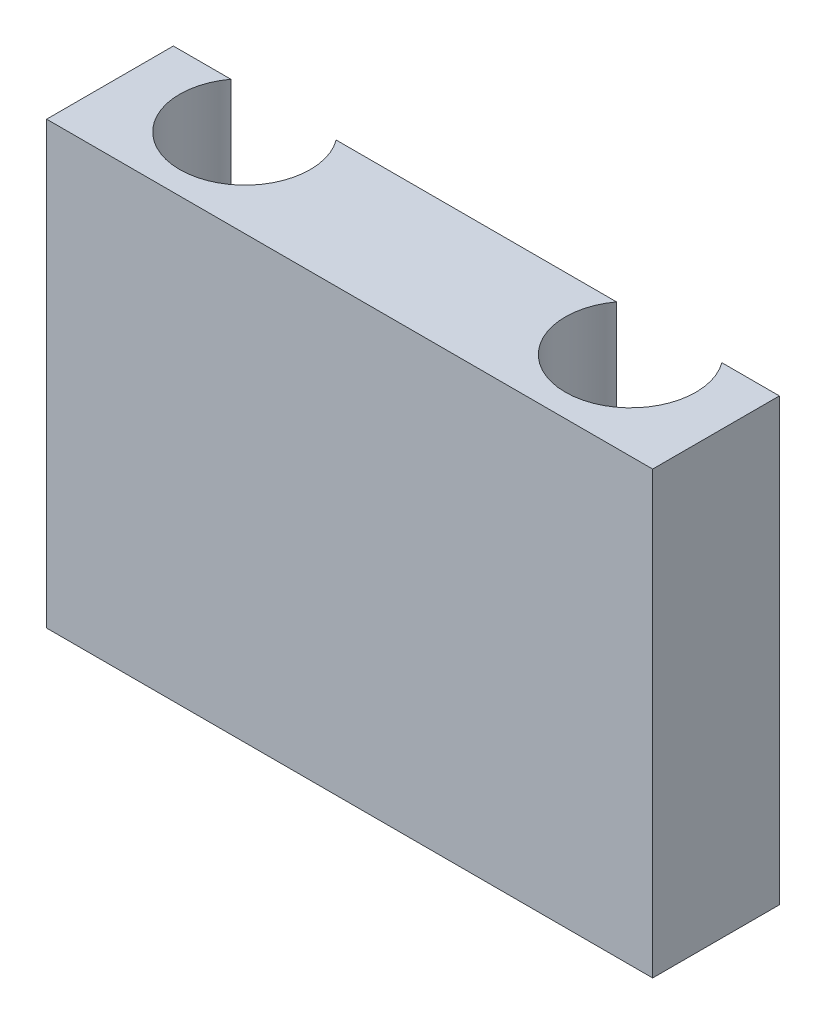
ISO-10303-21;
HEADER;
FILE_DESCRIPTION(('STEP AP214'),'2;1');
FILE_NAME('part.step','',(''),(''),'','','');
FILE_SCHEMA(('AUTOMOTIVE_DESIGN { 1 0 10303 214 1 1 1 1 }'));
ENDSEC;
DATA;
#1=APPLICATION_CONTEXT('core data for automotive mechanical design processes');
#2=APPLICATION_PROTOCOL_DEFINITION('international standard','automotive_design',2000,#1);
#3=PRODUCT_CONTEXT('',#1,'mechanical');
#4=PRODUCT('Part','Part','',(#3));
#5=PRODUCT_RELATED_PRODUCT_CATEGORY('part','',(#4));
#6=PRODUCT_DEFINITION_FORMATION('','',#4);
#7=PRODUCT_DEFINITION_CONTEXT('part definition',#1,'design');
#8=PRODUCT_DEFINITION('design','',#6,#7);
#9=PRODUCT_DEFINITION_SHAPE('','',#8);
#10=(LENGTH_UNIT() NAMED_UNIT(*) SI_UNIT(.MILLI.,.METRE.));
#11=(NAMED_UNIT(*) PLANE_ANGLE_UNIT() SI_UNIT($,.RADIAN.));
#12=(NAMED_UNIT(*) SI_UNIT($,.STERADIAN.) SOLID_ANGLE_UNIT());
#13=UNCERTAINTY_MEASURE_WITH_UNIT(LENGTH_MEASURE(1.E-05),#10,'distance_accuracy_value','');
#14=(GEOMETRIC_REPRESENTATION_CONTEXT(3) GLOBAL_UNCERTAINTY_ASSIGNED_CONTEXT((#13)) GLOBAL_UNIT_ASSIGNED_CONTEXT((#10,
#11,#12)) REPRESENTATION_CONTEXT('',''));
#15=CARTESIAN_POINT('',(0.,0.,0.));
#16=DIRECTION('',(0.,0.,1.));
#17=DIRECTION('',(1.,0.,0.));
#18=AXIS2_PLACEMENT_3D('',#15,#16,#17);
#19=CARTESIAN_POINT('',(0.,0.,0.));
#20=DIRECTION('',(0.,0.,-1.));
#21=DIRECTION('',(-1.,0.,0.));
#22=AXIS2_PLACEMENT_3D('',#19,#20,#21);
#23=PLANE('',#22);
#24=DIRECTION('',(0.,1.,0.));
#25=VECTOR('',#24,1.);
#26=CARTESIAN_POINT('',(17.,0.,0.));
#27=LINE('',#26,#25);
#28=CARTESIAN_POINT('',(17.,0.,0.));
#29=VERTEX_POINT('',#28);
#30=CARTESIAN_POINT('',(17.,16.,0.));
#31=VERTEX_POINT('',#30);
#32=EDGE_CURVE('E280',#29,#31,#27,.T.);
#33=ORIENTED_EDGE('',*,*,#32,.F.);
#34=DIRECTION('',(1.,0.,0.));
#35=VECTOR('',#34,1.);
#36=CARTESIAN_POINT('',(0.,0.,0.));
#37=LINE('',#36,#35);
#38=CARTESIAN_POINT('',(0.,0.,0.));
#39=VERTEX_POINT('',#38);
#40=EDGE_CURVE('E378',#39,#29,#37,.T.);
#41=ORIENTED_EDGE('',*,*,#40,.F.);
#42=DIRECTION('',(0.,-1.,0.));
#43=VECTOR('',#42,1.);
#44=CARTESIAN_POINT('',(0.,0.,0.));
#45=LINE('',#44,#43);
#46=CARTESIAN_POINT('',(0.,80.,0.));
#47=VERTEX_POINT('',#46);
#48=EDGE_CURVE('E354',#47,#39,#45,.T.);
#49=ORIENTED_EDGE('',*,*,#48,.F.);
#50=DIRECTION('',(-1.,0.,0.));
#51=VECTOR('',#50,1.);
#52=CARTESIAN_POINT('',(0.,80.,0.));
#53=LINE('',#52,#51);
#54=CARTESIAN_POINT('',(10.4384886131951,80.,0.));
#55=VERTEX_POINT('',#54);
#56=EDGE_CURVE('E385',#55,#47,#53,.T.);
#57=ORIENTED_EDGE('',*,*,#56,.F.);
#58=DIRECTION('',(0.,1.,0.));
#59=VECTOR('',#58,1.);
#60=CARTESIAN_POINT('',(10.4384886131951,63.,0.));
#61=LINE('',#60,#59);
#62=CARTESIAN_POINT('',(10.4384886131951,63.,0.));
#63=VERTEX_POINT('',#62);
#64=EDGE_CURVE('E446',#63,#55,#61,.T.);
#65=ORIENTED_EDGE('',*,*,#64,.F.);
#66=DIRECTION('',(1.,0.,0.));
#67=VECTOR('',#66,1.);
#68=CARTESIAN_POINT('',(0.,63.,0.));
#69=LINE('',#68,#67);
#70=CARTESIAN_POINT('',(14.1853632959574,63.,0.));
#71=VERTEX_POINT('',#70);
#72=EDGE_CURVE('E349',#63,#71,#69,.T.);
#73=ORIENTED_EDGE('',*,*,#72,.T.);
#74=DIRECTION('',(0.,1.,0.));
#75=VECTOR('',#74,1.);
#76=CARTESIAN_POINT('',(14.1853632959574,35.,0.));
#77=LINE('',#76,#75);
#78=CARTESIAN_POINT('',(14.1853632959574,35.,0.));
#79=VERTEX_POINT('',#78);
#80=EDGE_CURVE('E414',#79,#71,#77,.T.);
#81=ORIENTED_EDGE('',*,*,#80,.F.);
#82=DIRECTION('',(1.,0.,0.));
#83=VECTOR('',#82,1.);
#84=CARTESIAN_POINT('',(0.,35.,0.));
#85=LINE('',#84,#83);
#86=CARTESIAN_POINT('',(15.3567252935024,35.,0.));
#87=VERTEX_POINT('',#86);
#88=EDGE_CURVE('E406',#79,#87,#85,.T.);
#89=ORIENTED_EDGE('',*,*,#88,.T.);
#90=DIRECTION('',(0.,1.,0.));
#91=VECTOR('',#90,1.);
#92=CARTESIAN_POINT('',(15.3567252935024,16.,0.));
#93=LINE('',#92,#91);
#94=CARTESIAN_POINT('',(15.3567252935024,16.,0.));
#95=VERTEX_POINT('',#94);
#96=EDGE_CURVE('E323',#95,#87,#93,.T.);
#97=ORIENTED_EDGE('',*,*,#96,.F.);
#98=DIRECTION('',(1.,0.,0.));
#99=VECTOR('',#98,1.);
#100=CARTESIAN_POINT('',(0.,16.,0.));
#101=LINE('',#100,#99);
#102=EDGE_CURVE('E461',#95,#31,#101,.T.);
#103=ORIENTED_EDGE('',*,*,#102,.T.);
#104=EDGE_LOOP('',(#33,#41,#49,#57,#65,#73,#81,#89,#97,#103));
#105=FACE_BOUND('',#104,.T.);
#106=ADVANCED_FACE('F81',(#105),#23,.T.);
#107=DIRECTION('',(0.,1.,0.));
#108=VECTOR('',#107,1.);
#109=CARTESIAN_POINT('',(23.,0.,0.));
#110=LINE('',#109,#108);
#111=CARTESIAN_POINT('',(23.,0.,0.));
#112=VERTEX_POINT('',#111);
#113=CARTESIAN_POINT('',(23.,16.,0.));
#114=VERTEX_POINT('',#113);
#115=EDGE_CURVE('E250',#112,#114,#110,.T.);
#116=ORIENTED_EDGE('',*,*,#115,.T.);
#117=CARTESIAN_POINT('',(24.6432747064976,16.,0.));
#118=VERTEX_POINT('',#117);
#119=EDGE_CURVE('E460',#114,#118,#101,.T.);
#120=ORIENTED_EDGE('',*,*,#119,.T.);
#121=DIRECTION('',(0.,1.,0.));
#122=VECTOR('',#121,1.);
#123=CARTESIAN_POINT('',(24.6432747064976,16.,0.));
#124=LINE('',#123,#122);
#125=CARTESIAN_POINT('',(24.6432747064976,35.,0.));
#126=VERTEX_POINT('',#125);
#127=EDGE_CURVE('E319',#126,#118,#124,.F.);
#128=ORIENTED_EDGE('',*,*,#127,.F.);
#129=CARTESIAN_POINT('',(25.8146367040427,35.,0.));
#130=VERTEX_POINT('',#129);
#131=EDGE_CURVE('E405',#126,#130,#85,.T.);
#132=ORIENTED_EDGE('',*,*,#131,.T.);
#133=DIRECTION('',(0.,1.,0.));
#134=VECTOR('',#133,1.);
#135=CARTESIAN_POINT('',(25.8146367040427,35.,0.));
#136=LINE('',#135,#134);
#137=CARTESIAN_POINT('',(25.8146367040427,63.,0.));
#138=VERTEX_POINT('',#137);
#139=EDGE_CURVE('E410',#138,#130,#136,.F.);
#140=ORIENTED_EDGE('',*,*,#139,.F.);
#141=CARTESIAN_POINT('',(29.5615113868049,63.,0.));
#142=VERTEX_POINT('',#141);
#143=EDGE_CURVE('E345',#138,#142,#69,.T.);
#144=ORIENTED_EDGE('',*,*,#143,.T.);
#145=DIRECTION('',(0.,1.,0.));
#146=VECTOR('',#145,1.);
#147=CARTESIAN_POINT('',(29.5615113868049,63.,0.));
#148=LINE('',#147,#146);
#149=CARTESIAN_POINT('',(29.5615113868049,80.,0.));
#150=VERTEX_POINT('',#149);
#151=EDGE_CURVE('E443',#150,#142,#148,.F.);
#152=ORIENTED_EDGE('',*,*,#151,.F.);
#153=CARTESIAN_POINT('',(80.4384886131951,80.,0.));
#154=VERTEX_POINT('',#153);
#155=EDGE_CURVE('E389',#154,#150,#53,.T.);
#156=ORIENTED_EDGE('',*,*,#155,.F.);
#157=DIRECTION('',(0.,1.,0.));
#158=VECTOR('',#157,1.);
#159=CARTESIAN_POINT('',(80.4384886131951,63.,0.));
#160=LINE('',#159,#158);
#161=CARTESIAN_POINT('',(80.4384886131951,63.,0.));
#162=VERTEX_POINT('',#161);
#163=EDGE_CURVE('E440',#162,#154,#160,.T.);
#164=ORIENTED_EDGE('',*,*,#163,.F.);
#165=DIRECTION('',(1.,0.,0.));
#166=VECTOR('',#165,1.);
#167=CARTESIAN_POINT('',(0.,63.,0.));
#168=LINE('',#167,#166);
#169=CARTESIAN_POINT('',(84.1853632959573,63.,0.));
#170=VERTEX_POINT('',#169);
#171=EDGE_CURVE('E344',#162,#170,#168,.T.);
#172=ORIENTED_EDGE('',*,*,#171,.T.);
#173=DIRECTION('',(0.,1.,0.));
#174=VECTOR('',#173,1.);
#175=CARTESIAN_POINT('',(84.1853632959573,35.,0.));
#176=LINE('',#175,#174);
#177=CARTESIAN_POINT('',(84.1853632959573,35.,0.));
#178=VERTEX_POINT('',#177);
#179=EDGE_CURVE('E427',#178,#170,#176,.T.);
#180=ORIENTED_EDGE('',*,*,#179,.F.);
#181=DIRECTION('',(1.,0.,0.));
#182=VECTOR('',#181,1.);
#183=CARTESIAN_POINT('',(0.,35.,0.));
#184=LINE('',#183,#182);
#185=CARTESIAN_POINT('',(85.3567252935024,35.,0.));
#186=VERTEX_POINT('',#185);
#187=EDGE_CURVE('E419',#178,#186,#184,.T.);
#188=ORIENTED_EDGE('',*,*,#187,.T.);
#189=DIRECTION('',(0.,1.,0.));
#190=VECTOR('',#189,1.);
#191=CARTESIAN_POINT('',(85.3567252935024,16.,0.));
#192=LINE('',#191,#190);
#193=CARTESIAN_POINT('',(85.3567252935024,16.,0.));
#194=VERTEX_POINT('',#193);
#195=EDGE_CURVE('E316',#194,#186,#192,.T.);
#196=ORIENTED_EDGE('',*,*,#195,.F.);
#197=DIRECTION('',(1.,0.,0.));
#198=VECTOR('',#197,1.);
#199=CARTESIAN_POINT('',(0.,16.,0.));
#200=LINE('',#199,#198);
#201=CARTESIAN_POINT('',(87.,16.,0.));
#202=VERTEX_POINT('',#201);
#203=EDGE_CURVE('E456',#194,#202,#200,.T.);
#204=ORIENTED_EDGE('',*,*,#203,.T.);
#205=DIRECTION('',(0.,1.,0.));
#206=VECTOR('',#205,1.);
#207=CARTESIAN_POINT('',(87.,0.,0.));
#208=LINE('',#207,#206);
#209=CARTESIAN_POINT('',(87.,0.,0.));
#210=VERTEX_POINT('',#209);
#211=EDGE_CURVE('E292',#210,#202,#208,.T.);
#212=ORIENTED_EDGE('',*,*,#211,.F.);
#213=EDGE_CURVE('E382',#112,#210,#37,.T.);
#214=ORIENTED_EDGE('',*,*,#213,.F.);
#215=EDGE_LOOP('',(#116,#120,#128,#132,#140,#144,#152,#156,#164,#172,#180,#188,#196,#204,#212,#214));
#216=FACE_BOUND('',#215,.T.);
#217=ADVANCED_FACE('F503',(#216),#23,.T.);
#218=CARTESIAN_POINT('',(20.,35.,7.));
#219=DIRECTION('',(0.,1.,0.));
#220=DIRECTION('',(0.,0.,1.));
#221=AXIS2_PLACEMENT_3D('',#218,#219,#220);
#222=CYLINDRICAL_SURFACE('',#221,9.1);
#223=CARTESIAN_POINT('',(20.,63.,7.));
#224=DIRECTION('',(0.,1.,0.));
#225=DIRECTION('',(0.,0.,1.));
#226=AXIS2_PLACEMENT_3D('',#223,#224,#225);
#227=CIRCLE('',#226,9.1);
#228=EDGE_CURVE('E434',#138,#71,#227,.F.);
#229=ORIENTED_EDGE('',*,*,#228,.F.);
#230=ORIENTED_EDGE('',*,*,#139,.T.);
#231=CARTESIAN_POINT('',(20.,35.,7.));
#232=DIRECTION('',(0.,1.,0.));
#233=DIRECTION('',(0.,0.,1.));
#234=AXIS2_PLACEMENT_3D('',#231,#232,#233);
#235=CIRCLE('',#234,9.1);
#236=EDGE_CURVE('E355',#79,#130,#235,.T.);
#237=ORIENTED_EDGE('',*,*,#236,.F.);
#238=ORIENTED_EDGE('',*,*,#80,.T.);
#239=EDGE_LOOP('',(#229,#230,#237,#238));
#240=FACE_BOUND('',#239,.T.);
#241=ADVANCED_FACE('F683',(#240),#222,.F.);
#242=CARTESIAN_POINT('',(90.,35.,6.99999999999999));
#243=DIRECTION('',(0.,1.,0.));
#244=DIRECTION('',(0.,0.,1.));
#245=AXIS2_PLACEMENT_3D('',#242,#243,#244);
#246=CYLINDRICAL_SURFACE('',#245,9.1);
#247=CARTESIAN_POINT('',(90.,63.,6.99999999999999));
#248=DIRECTION('',(0.,1.,0.));
#249=DIRECTION('',(0.,0.,1.));
#250=AXIS2_PLACEMENT_3D('',#247,#248,#249);
#251=CIRCLE('',#250,9.1);
#252=CARTESIAN_POINT('',(95.8146367040427,63.,0.));
#253=VERTEX_POINT('',#252);
#254=EDGE_CURVE('E431',#253,#170,#251,.F.);
#255=ORIENTED_EDGE('',*,*,#254,.F.);
#256=DIRECTION('',(0.,1.,0.));
#257=VECTOR('',#256,1.);
#258=CARTESIAN_POINT('',(95.8146367040427,35.,0.));
#259=LINE('',#258,#257);
#260=CARTESIAN_POINT('',(95.8146367040427,35.,0.));
#261=VERTEX_POINT('',#260);
#262=EDGE_CURVE('E423',#253,#261,#259,.F.);
#263=ORIENTED_EDGE('',*,*,#262,.T.);
#264=CARTESIAN_POINT('',(90.,35.,6.99999999999999));
#265=DIRECTION('',(0.,1.,0.));
#266=DIRECTION('',(0.,0.,1.));
#267=AXIS2_PLACEMENT_3D('',#264,#265,#266);
#268=CIRCLE('',#267,9.1);
#269=EDGE_CURVE('E350',#178,#261,#268,.T.);
#270=ORIENTED_EDGE('',*,*,#269,.F.);
#271=ORIENTED_EDGE('',*,*,#179,.T.);
#272=EDGE_LOOP('',(#255,#263,#270,#271));
#273=FACE_BOUND('',#272,.T.);
#274=ADVANCED_FACE('F520',(#273),#246,.F.);
#275=CARTESIAN_POINT('',(0.,0.,23.));
#276=DIRECTION('',(1.,0.,0.));
#277=DIRECTION('',(0.,0.,-1.));
#278=AXIS2_PLACEMENT_3D('',#275,#276,#277);
#279=PLANE('',#278);
#280=ORIENTED_EDGE('',*,*,#48,.T.);
#281=DIRECTION('',(0.,0.,-1.));
#282=VECTOR('',#281,1.);
#283=CARTESIAN_POINT('',(0.,0.,23.));
#284=LINE('',#283,#282);
#285=CARTESIAN_POINT('',(0.,0.,23.));
#286=VERTEX_POINT('',#285);
#287=EDGE_CURVE('E401',#286,#39,#284,.T.);
#288=ORIENTED_EDGE('',*,*,#287,.F.);
#289=DIRECTION('',(0.,-1.,0.));
#290=VECTOR('',#289,1.);
#291=CARTESIAN_POINT('',(0.,0.,23.));
#292=LINE('',#291,#290);
#293=CARTESIAN_POINT('',(0.,80.,23.));
#294=VERTEX_POINT('',#293);
#295=EDGE_CURVE('E359',#294,#286,#292,.T.);
#296=ORIENTED_EDGE('',*,*,#295,.F.);
#297=DIRECTION('',(0.,0.,-1.));
#298=VECTOR('',#297,1.);
#299=CARTESIAN_POINT('',(0.,80.,23.));
#300=LINE('',#299,#298);
#301=EDGE_CURVE('E373',#294,#47,#300,.T.);
#302=ORIENTED_EDGE('',*,*,#301,.T.);
#303=EDGE_LOOP('',(#280,#288,#296,#302));
#304=FACE_BOUND('',#303,.T.);
#305=ADVANCED_FACE('F83',(#304),#279,.F.);
#306=CARTESIAN_POINT('',(0.,0.,23.));
#307=DIRECTION('',(0.,1.,0.));
#308=DIRECTION('',(0.,0.,1.));
#309=AXIS2_PLACEMENT_3D('',#306,#307,#308);
#310=PLANE('',#309);
#311=ORIENTED_EDGE('',*,*,#40,.T.);
#312=DIRECTION('',(0.,0.,1.));
#313=VECTOR('',#312,1.);
#314=CARTESIAN_POINT('',(17.,0.,6.99999999999999));
#315=LINE('',#314,#313);
#316=CARTESIAN_POINT('',(17.,0.,6.99999999999999));
#317=VERTEX_POINT('',#316);
#318=EDGE_CURVE('E251',#29,#317,#315,.T.);
#319=ORIENTED_EDGE('',*,*,#318,.T.);
#320=CARTESIAN_POINT('',(20.,0.,7.));
#321=DIRECTION('',(0.,1.,0.));
#322=DIRECTION('',(0.,0.,1.));
#323=AXIS2_PLACEMENT_3D('',#320,#321,#322);
#324=CIRCLE('',#323,3.);
#325=CARTESIAN_POINT('',(23.,0.,6.99999999999999));
#326=VERTEX_POINT('',#325);
#327=EDGE_CURVE('E244',#317,#326,#324,.T.);
#328=ORIENTED_EDGE('',*,*,#327,.T.);
#329=DIRECTION('',(0.,0.,-1.));
#330=VECTOR('',#329,1.);
#331=CARTESIAN_POINT('',(23.,0.,6.99999999999999));
#332=LINE('',#331,#330);
#333=EDGE_CURVE('E254',#326,#112,#332,.T.);
#334=ORIENTED_EDGE('',*,*,#333,.T.);
#335=ORIENTED_EDGE('',*,*,#213,.T.);
#336=DIRECTION('',(0.,0.,1.));
#337=VECTOR('',#336,1.);
#338=CARTESIAN_POINT('',(87.,0.,6.99999999999999));
#339=LINE('',#338,#337);
#340=CARTESIAN_POINT('',(87.,0.,6.99999999999999));
#341=VERTEX_POINT('',#340);
#342=EDGE_CURVE('E287',#210,#341,#339,.T.);
#343=ORIENTED_EDGE('',*,*,#342,.T.);
#344=CARTESIAN_POINT('',(90.,0.,6.99999999999999));
#345=DIRECTION('',(0.,1.,0.));
#346=DIRECTION('',(0.,0.,1.));
#347=AXIS2_PLACEMENT_3D('',#344,#345,#346);
#348=CIRCLE('',#347,3.);
#349=CARTESIAN_POINT('',(93.,0.,6.99999999999999));
#350=VERTEX_POINT('',#349);
#351=EDGE_CURVE('E265',#341,#350,#348,.T.);
#352=ORIENTED_EDGE('',*,*,#351,.T.);
#353=DIRECTION('',(0.,0.,-1.));
#354=VECTOR('',#353,1.);
#355=CARTESIAN_POINT('',(93.,0.,6.99999999999999));
#356=LINE('',#355,#354);
#357=CARTESIAN_POINT('',(93.,0.,0.));
#358=VERTEX_POINT('',#357);
#359=EDGE_CURVE('E271',#350,#358,#356,.T.);
#360=ORIENTED_EDGE('',*,*,#359,.T.);
#361=CARTESIAN_POINT('',(110.,0.,0.));
#362=VERTEX_POINT('',#361);
#363=EDGE_CURVE('E377',#358,#362,#37,.T.);
#364=ORIENTED_EDGE('',*,*,#363,.T.);
#365=DIRECTION('',(0.,0.,-1.));
#366=VECTOR('',#365,1.);
#367=CARTESIAN_POINT('',(110.,0.,23.));
#368=LINE('',#367,#366);
#369=CARTESIAN_POINT('',(110.,0.,23.));
#370=VERTEX_POINT('',#369);
#371=EDGE_CURVE('E397',#370,#362,#368,.T.);
#372=ORIENTED_EDGE('',*,*,#371,.F.);
#373=DIRECTION('',(1.,0.,0.));
#374=VECTOR('',#373,1.);
#375=CARTESIAN_POINT('',(0.,0.,23.));
#376=LINE('',#375,#374);
#377=EDGE_CURVE('E363',#286,#370,#376,.T.);
#378=ORIENTED_EDGE('',*,*,#377,.F.);
#379=ORIENTED_EDGE('',*,*,#287,.T.);
#380=EDGE_LOOP('',(#311,#319,#328,#334,#335,#343,#352,#360,#364,#372,#378,#379));
#381=FACE_BOUND('',#380,.T.);
#382=ADVANCED_FACE('F263',(#381),#310,.F.);
#383=CARTESIAN_POINT('',(110.,0.,23.));
#384=DIRECTION('',(-1.,0.,0.));
#385=DIRECTION('',(0.,0.,1.));
#386=AXIS2_PLACEMENT_3D('',#383,#384,#385);
#387=PLANE('',#386);
#388=DIRECTION('',(0.,1.,0.));
#389=VECTOR('',#388,1.);
#390=CARTESIAN_POINT('',(110.,0.,0.));
#391=LINE('',#390,#389);
#392=CARTESIAN_POINT('',(110.,80.,0.));
#393=VERTEX_POINT('',#392);
#394=EDGE_CURVE('E381',#362,#393,#391,.T.);
#395=ORIENTED_EDGE('',*,*,#394,.T.);
#396=DIRECTION('',(0.,0.,-1.));
#397=VECTOR('',#396,1.);
#398=CARTESIAN_POINT('',(110.,80.,23.));
#399=LINE('',#398,#397);
#400=CARTESIAN_POINT('',(110.,80.,23.));
#401=VERTEX_POINT('',#400);
#402=EDGE_CURVE('E393',#401,#393,#399,.T.);
#403=ORIENTED_EDGE('',*,*,#402,.F.);
#404=DIRECTION('',(0.,1.,0.));
#405=VECTOR('',#404,1.);
#406=CARTESIAN_POINT('',(110.,0.,23.));
#407=LINE('',#406,#405);
#408=EDGE_CURVE('E367',#370,#401,#407,.T.);
#409=ORIENTED_EDGE('',*,*,#408,.F.);
#410=ORIENTED_EDGE('',*,*,#371,.T.);
#411=EDGE_LOOP('',(#395,#403,#409,#410));
#412=FACE_BOUND('',#411,.T.);
#413=ADVANCED_FACE('F737',(#412),#387,.F.);
#414=CARTESIAN_POINT('',(0.,80.,23.));
#415=DIRECTION('',(0.,-1.,0.));
#416=DIRECTION('',(0.,0.,-1.));
#417=AXIS2_PLACEMENT_3D('',#414,#415,#416);
#418=PLANE('',#417);
#419=ORIENTED_EDGE('',*,*,#155,.T.);
#420=CARTESIAN_POINT('',(20.,80.,7.));
#421=DIRECTION('',(0.,1.,0.));
#422=DIRECTION('',(0.,0.,1.));
#423=AXIS2_PLACEMENT_3D('',#420,#421,#422);
#424=CIRCLE('',#423,11.85);
#425=EDGE_CURVE('E332',#55,#150,#424,.T.);
#426=ORIENTED_EDGE('',*,*,#425,.F.);
#427=ORIENTED_EDGE('',*,*,#56,.T.);
#428=ORIENTED_EDGE('',*,*,#301,.F.);
#429=DIRECTION('',(-1.,0.,0.));
#430=VECTOR('',#429,1.);
#431=CARTESIAN_POINT('',(0.,80.,23.));
#432=LINE('',#431,#430);
#433=EDGE_CURVE('E370',#401,#294,#432,.T.);
#434=ORIENTED_EDGE('',*,*,#433,.F.);
#435=ORIENTED_EDGE('',*,*,#402,.T.);
#436=CARTESIAN_POINT('',(99.5615113868049,80.,0.));
#437=VERTEX_POINT('',#436);
#438=EDGE_CURVE('E364',#393,#437,#53,.T.);
#439=ORIENTED_EDGE('',*,*,#438,.T.);
#440=CARTESIAN_POINT('',(90.,80.,6.99999999999999));
#441=DIRECTION('',(0.,1.,0.));
#442=DIRECTION('',(0.,0.,1.));
#443=AXIS2_PLACEMENT_3D('',#440,#441,#442);
#444=CIRCLE('',#443,11.85);
#445=EDGE_CURVE('E335',#154,#437,#444,.T.);
#446=ORIENTED_EDGE('',*,*,#445,.F.);
#447=EDGE_LOOP('',(#419,#426,#427,#428,#434,#435,#439,#446));
#448=FACE_BOUND('',#447,.T.);
#449=ADVANCED_FACE('F695',(#448),#418,.F.);
#450=CARTESIAN_POINT('',(0.,0.,23.));
#451=DIRECTION('',(0.,0.,-1.));
#452=DIRECTION('',(-1.,0.,0.));
#453=AXIS2_PLACEMENT_3D('',#450,#451,#452);
#454=PLANE('',#453);
#455=ORIENTED_EDGE('',*,*,#295,.T.);
#456=ORIENTED_EDGE('',*,*,#377,.T.);
#457=ORIENTED_EDGE('',*,*,#408,.T.);
#458=ORIENTED_EDGE('',*,*,#433,.T.);
#459=EDGE_LOOP('',(#455,#456,#457,#458));
#460=FACE_BOUND('',#459,.T.);
#461=ADVANCED_FACE('F723',(#460),#454,.F.);
#462=DIRECTION('',(0.,1.,0.));
#463=VECTOR('',#462,1.);
#464=CARTESIAN_POINT('',(93.,0.,0.));
#465=LINE('',#464,#463);
#466=CARTESIAN_POINT('',(93.,16.,0.));
#467=VERTEX_POINT('',#466);
#468=EDGE_CURVE('E288',#358,#467,#465,.T.);
#469=ORIENTED_EDGE('',*,*,#468,.T.);
#470=CARTESIAN_POINT('',(94.6432747064976,16.,0.));
#471=VERTEX_POINT('',#470);
#472=EDGE_CURVE('E455',#467,#471,#200,.T.);
#473=ORIENTED_EDGE('',*,*,#472,.T.);
#474=DIRECTION('',(0.,1.,0.));
#475=VECTOR('',#474,1.);
#476=CARTESIAN_POINT('',(94.6432747064976,16.,0.));
#477=LINE('',#476,#475);
#478=CARTESIAN_POINT('',(94.6432747064976,35.,0.));
#479=VERTEX_POINT('',#478);
#480=EDGE_CURVE('E309',#479,#471,#477,.F.);
#481=ORIENTED_EDGE('',*,*,#480,.F.);
#482=EDGE_CURVE('E418',#479,#261,#184,.T.);
#483=ORIENTED_EDGE('',*,*,#482,.T.);
#484=ORIENTED_EDGE('',*,*,#262,.F.);
#485=CARTESIAN_POINT('',(99.5615113868049,63.,0.));
#486=VERTEX_POINT('',#485);
#487=EDGE_CURVE('E331',#253,#486,#168,.T.);
#488=ORIENTED_EDGE('',*,*,#487,.T.);
#489=DIRECTION('',(0.,1.,0.));
#490=VECTOR('',#489,1.);
#491=CARTESIAN_POINT('',(99.5615113868049,63.,0.));
#492=LINE('',#491,#490);
#493=EDGE_CURVE('E437',#437,#486,#492,.F.);
#494=ORIENTED_EDGE('',*,*,#493,.F.);
#495=ORIENTED_EDGE('',*,*,#438,.F.);
#496=ORIENTED_EDGE('',*,*,#394,.F.);
#497=ORIENTED_EDGE('',*,*,#363,.F.);
#498=EDGE_LOOP('',(#469,#473,#481,#483,#484,#488,#494,#495,#496,#497));
#499=FACE_BOUND('',#498,.T.);
#500=ADVANCED_FACE('F490',(#499),#23,.T.);
#501=CARTESIAN_POINT('',(20.,35.,7.));
#502=DIRECTION('',(0.,1.,0.));
#503=DIRECTION('',(0.,0.,1.));
#504=AXIS2_PLACEMENT_3D('',#501,#502,#503);
#505=PLANE('',#504);
#506=CARTESIAN_POINT('',(20.,35.,7.));
#507=DIRECTION('',(0.,1.,0.));
#508=DIRECTION('',(0.,0.,1.));
#509=AXIS2_PLACEMENT_3D('',#506,#507,#508);
#510=CIRCLE('',#509,8.4);
#511=EDGE_CURVE('E452',#87,#126,#510,.T.);
#512=ORIENTED_EDGE('',*,*,#511,.F.);
#513=ORIENTED_EDGE('',*,*,#88,.F.);
#514=ORIENTED_EDGE('',*,*,#236,.T.);
#515=ORIENTED_EDGE('',*,*,#131,.F.);
#516=EDGE_LOOP('',(#512,#513,#514,#515));
#517=FACE_BOUND('',#516,.T.);
#518=ADVANCED_FACE('F678',(#517),#505,.T.);
#519=CARTESIAN_POINT('',(90.,35.,6.99999999999999));
#520=DIRECTION('',(0.,1.,0.));
#521=DIRECTION('',(0.,0.,1.));
#522=AXIS2_PLACEMENT_3D('',#519,#520,#521);
#523=PLANE('',#522);
#524=CARTESIAN_POINT('',(90.,35.,6.99999999999999));
#525=DIRECTION('',(0.,1.,0.));
#526=DIRECTION('',(0.,0.,1.));
#527=AXIS2_PLACEMENT_3D('',#524,#525,#526);
#528=CIRCLE('',#527,8.4);
#529=EDGE_CURVE('E449',#186,#479,#528,.T.);
#530=ORIENTED_EDGE('',*,*,#529,.F.);
#531=ORIENTED_EDGE('',*,*,#187,.F.);
#532=ORIENTED_EDGE('',*,*,#269,.T.);
#533=ORIENTED_EDGE('',*,*,#482,.F.);
#534=EDGE_LOOP('',(#530,#531,#532,#533));
#535=FACE_BOUND('',#534,.T.);
#536=ADVANCED_FACE('F516',(#535),#523,.T.);
#537=CARTESIAN_POINT('',(90.,63.,6.99999999999999));
#538=DIRECTION('',(0.,1.,0.));
#539=DIRECTION('',(0.,0.,1.));
#540=AXIS2_PLACEMENT_3D('',#537,#538,#539);
#541=CYLINDRICAL_SURFACE('',#540,11.85);
#542=ORIENTED_EDGE('',*,*,#163,.T.);
#543=ORIENTED_EDGE('',*,*,#445,.T.);
#544=ORIENTED_EDGE('',*,*,#493,.T.);
#545=CARTESIAN_POINT('',(90.,63.,6.99999999999999));
#546=DIRECTION('',(0.,1.,0.));
#547=DIRECTION('',(0.,0.,1.));
#548=AXIS2_PLACEMENT_3D('',#545,#546,#547);
#549=CIRCLE('',#548,11.85);
#550=EDGE_CURVE('E326',#162,#486,#549,.T.);
#551=ORIENTED_EDGE('',*,*,#550,.F.);
#552=EDGE_LOOP('',(#542,#543,#544,#551));
#553=FACE_BOUND('',#552,.T.);
#554=ADVANCED_FACE('F702',(#553),#541,.F.);
#555=CARTESIAN_POINT('',(90.,63.,6.99999999999999));
#556=DIRECTION('',(0.,1.,0.));
#557=DIRECTION('',(0.,0.,1.));
#558=AXIS2_PLACEMENT_3D('',#555,#556,#557);
#559=PLANE('',#558);
#560=ORIENTED_EDGE('',*,*,#550,.T.);
#561=ORIENTED_EDGE('',*,*,#487,.F.);
#562=ORIENTED_EDGE('',*,*,#254,.T.);
#563=ORIENTED_EDGE('',*,*,#171,.F.);
#564=EDGE_LOOP('',(#560,#561,#562,#563));
#565=FACE_BOUND('',#564,.T.);
#566=ADVANCED_FACE('F704',(#565),#559,.T.);
#567=CARTESIAN_POINT('',(20.,63.,7.));
#568=DIRECTION('',(0.,1.,0.));
#569=DIRECTION('',(0.,0.,1.));
#570=AXIS2_PLACEMENT_3D('',#567,#568,#569);
#571=CYLINDRICAL_SURFACE('',#570,11.85);
#572=ORIENTED_EDGE('',*,*,#64,.T.);
#573=ORIENTED_EDGE('',*,*,#425,.T.);
#574=ORIENTED_EDGE('',*,*,#151,.T.);
#575=CARTESIAN_POINT('',(20.,63.,7.));
#576=DIRECTION('',(0.,1.,0.));
#577=DIRECTION('',(0.,0.,1.));
#578=AXIS2_PLACEMENT_3D('',#575,#576,#577);
#579=CIRCLE('',#578,11.85);
#580=EDGE_CURVE('E327',#63,#142,#579,.T.);
#581=ORIENTED_EDGE('',*,*,#580,.F.);
#582=EDGE_LOOP('',(#572,#573,#574,#581));
#583=FACE_BOUND('',#582,.T.);
#584=ADVANCED_FACE('F692',(#583),#571,.F.);
#585=CARTESIAN_POINT('',(20.,63.,7.));
#586=DIRECTION('',(0.,1.,0.));
#587=DIRECTION('',(0.,0.,1.));
#588=AXIS2_PLACEMENT_3D('',#585,#586,#587);
#589=PLANE('',#588);
#590=ORIENTED_EDGE('',*,*,#580,.T.);
#591=ORIENTED_EDGE('',*,*,#143,.F.);
#592=ORIENTED_EDGE('',*,*,#228,.T.);
#593=ORIENTED_EDGE('',*,*,#72,.F.);
#594=EDGE_LOOP('',(#590,#591,#592,#593));
#595=FACE_BOUND('',#594,.T.);
#596=ADVANCED_FACE('F685',(#595),#589,.T.);
#597=CARTESIAN_POINT('',(90.,16.,6.99999999999999));
#598=DIRECTION('',(0.,1.,0.));
#599=DIRECTION('',(0.,0.,1.));
#600=AXIS2_PLACEMENT_3D('',#597,#598,#599);
#601=CYLINDRICAL_SURFACE('',#600,8.4);
#602=ORIENTED_EDGE('',*,*,#195,.T.);
#603=ORIENTED_EDGE('',*,*,#529,.T.);
#604=ORIENTED_EDGE('',*,*,#480,.T.);
#605=CARTESIAN_POINT('',(90.,16.,6.99999999999999));
#606=DIRECTION('',(0.,1.,0.));
#607=DIRECTION('',(0.,0.,1.));
#608=AXIS2_PLACEMENT_3D('',#605,#606,#607);
#609=CIRCLE('',#608,8.4);
#610=EDGE_CURVE('E279',#194,#471,#609,.T.);
#611=ORIENTED_EDGE('',*,*,#610,.F.);
#612=EDGE_LOOP('',(#602,#603,#604,#611));
#613=FACE_BOUND('',#612,.T.);
#614=ADVANCED_FACE('F510',(#613),#601,.F.);
#615=CARTESIAN_POINT('',(90.,16.,6.99999999999999));
#616=DIRECTION('',(0.,1.,0.));
#617=DIRECTION('',(0.,0.,1.));
#618=AXIS2_PLACEMENT_3D('',#615,#616,#617);
#619=PLANE('',#618);
#620=DIRECTION('',(0.,0.,1.));
#621=VECTOR('',#620,1.);
#622=CARTESIAN_POINT('',(87.,16.,6.99999999999999));
#623=LINE('',#622,#621);
#624=CARTESIAN_POINT('',(87.,16.,6.99999999999999));
#625=VERTEX_POINT('',#624);
#626=EDGE_CURVE('E12',#202,#625,#623,.T.);
#627=ORIENTED_EDGE('',*,*,#626,.F.);
#628=ORIENTED_EDGE('',*,*,#203,.F.);
#629=ORIENTED_EDGE('',*,*,#610,.T.);
#630=ORIENTED_EDGE('',*,*,#472,.F.);
#631=DIRECTION('',(0.,0.,-1.));
#632=VECTOR('',#631,1.);
#633=CARTESIAN_POINT('',(93.,16.,6.99999999999999));
#634=LINE('',#633,#632);
#635=CARTESIAN_POINT('',(93.,16.,6.99999999999999));
#636=VERTEX_POINT('',#635);
#637=EDGE_CURVE('E473',#636,#467,#634,.T.);
#638=ORIENTED_EDGE('',*,*,#637,.F.);
#639=CARTESIAN_POINT('',(90.,16.,6.99999999999999));
#640=DIRECTION('',(0.,1.,0.));
#641=DIRECTION('',(0.,0.,1.));
#642=AXIS2_PLACEMENT_3D('',#639,#640,#641);
#643=CIRCLE('',#642,3.);
#644=EDGE_CURVE('E90',#625,#636,#643,.T.);
#645=ORIENTED_EDGE('',*,*,#644,.F.);
#646=EDGE_LOOP('',(#627,#628,#629,#630,#638,#645));
#647=FACE_BOUND('',#646,.T.);
#648=ADVANCED_FACE('F486',(#647),#619,.T.);
#649=CARTESIAN_POINT('',(20.,16.,7.));
#650=DIRECTION('',(0.,1.,0.));
#651=DIRECTION('',(0.,0.,1.));
#652=AXIS2_PLACEMENT_3D('',#649,#650,#651);
#653=CYLINDRICAL_SURFACE('',#652,8.4);
#654=ORIENTED_EDGE('',*,*,#96,.T.);
#655=ORIENTED_EDGE('',*,*,#511,.T.);
#656=ORIENTED_EDGE('',*,*,#127,.T.);
#657=CARTESIAN_POINT('',(20.,16.,7.));
#658=DIRECTION('',(0.,1.,0.));
#659=DIRECTION('',(0.,0.,1.));
#660=AXIS2_PLACEMENT_3D('',#657,#658,#659);
#661=CIRCLE('',#660,8.4);
#662=EDGE_CURVE('E305',#95,#118,#661,.T.);
#663=ORIENTED_EDGE('',*,*,#662,.F.);
#664=EDGE_LOOP('',(#654,#655,#656,#663));
#665=FACE_BOUND('',#664,.T.);
#666=ADVANCED_FACE('F669',(#665),#653,.F.);
#667=CARTESIAN_POINT('',(20.,16.,7.));
#668=DIRECTION('',(0.,1.,0.));
#669=DIRECTION('',(0.,0.,1.));
#670=AXIS2_PLACEMENT_3D('',#667,#668,#669);
#671=PLANE('',#670);
#672=DIRECTION('',(0.,0.,1.));
#673=VECTOR('',#672,1.);
#674=CARTESIAN_POINT('',(17.,16.,7.));
#675=LINE('',#674,#673);
#676=CARTESIAN_POINT('',(17.,16.,6.99999999999999));
#677=VERTEX_POINT('',#676);
#678=EDGE_CURVE('E470',#31,#677,#675,.T.);
#679=ORIENTED_EDGE('',*,*,#678,.F.);
#680=ORIENTED_EDGE('',*,*,#102,.F.);
#681=ORIENTED_EDGE('',*,*,#662,.T.);
#682=ORIENTED_EDGE('',*,*,#119,.F.);
#683=DIRECTION('',(0.,0.,-1.));
#684=VECTOR('',#683,1.);
#685=CARTESIAN_POINT('',(23.,16.,7.));
#686=LINE('',#685,#684);
#687=CARTESIAN_POINT('',(23.,16.,6.99999999999999));
#688=VERTEX_POINT('',#687);
#689=EDGE_CURVE('E465',#688,#114,#686,.T.);
#690=ORIENTED_EDGE('',*,*,#689,.F.);
#691=CARTESIAN_POINT('',(20.,16.,7.));
#692=DIRECTION('',(0.,1.,0.));
#693=DIRECTION('',(0.,0.,1.));
#694=AXIS2_PLACEMENT_3D('',#691,#692,#693);
#695=CIRCLE('',#694,3.);
#696=EDGE_CURVE('E247',#677,#688,#695,.T.);
#697=ORIENTED_EDGE('',*,*,#696,.F.);
#698=EDGE_LOOP('',(#679,#680,#681,#682,#690,#697));
#699=FACE_BOUND('',#698,.T.);
#700=ADVANCED_FACE('F673',(#699),#671,.T.);
#701=CARTESIAN_POINT('',(20.,0.,7.));
#702=DIRECTION('',(0.,1.,0.));
#703=DIRECTION('',(0.,0.,1.));
#704=AXIS2_PLACEMENT_3D('',#701,#702,#703);
#705=CYLINDRICAL_SURFACE('',#704,3.);
#706=ORIENTED_EDGE('',*,*,#696,.T.);
#707=DIRECTION('',(0.,1.,0.));
#708=VECTOR('',#707,1.);
#709=CARTESIAN_POINT('',(23.,0.,6.99999999999999));
#710=LINE('',#709,#708);
#711=EDGE_CURVE('E105',#326,#688,#710,.T.);
#712=ORIENTED_EDGE('',*,*,#711,.F.);
#713=ORIENTED_EDGE('',*,*,#327,.F.);
#714=DIRECTION('',(0.,1.,0.));
#715=VECTOR('',#714,1.);
#716=CARTESIAN_POINT('',(17.,0.,6.99999999999999));
#717=LINE('',#716,#715);
#718=EDGE_CURVE('E276',#317,#677,#717,.T.);
#719=ORIENTED_EDGE('',*,*,#718,.T.);
#720=EDGE_LOOP('',(#706,#712,#713,#719));
#721=FACE_BOUND('',#720,.T.);
#722=ADVANCED_FACE('F241',(#721),#705,.F.);
#723=CARTESIAN_POINT('',(17.,0.,6.99999999999999));
#724=DIRECTION('',(-1.,0.,0.));
#725=DIRECTION('',(0.,0.,1.));
#726=AXIS2_PLACEMENT_3D('',#723,#724,#725);
#727=PLANE('',#726);
#728=ORIENTED_EDGE('',*,*,#678,.T.);
#729=ORIENTED_EDGE('',*,*,#718,.F.);
#730=ORIENTED_EDGE('',*,*,#318,.F.);
#731=ORIENTED_EDGE('',*,*,#32,.T.);
#732=EDGE_LOOP('',(#728,#729,#730,#731));
#733=FACE_BOUND('',#732,.T.);
#734=ADVANCED_FACE('F793',(#733),#727,.F.);
#735=CARTESIAN_POINT('',(23.,0.,6.99999999999999));
#736=DIRECTION('',(1.,0.,0.));
#737=DIRECTION('',(0.,0.,-1.));
#738=AXIS2_PLACEMENT_3D('',#735,#736,#737);
#739=PLANE('',#738);
#740=ORIENTED_EDGE('',*,*,#689,.T.);
#741=ORIENTED_EDGE('',*,*,#115,.F.);
#742=ORIENTED_EDGE('',*,*,#333,.F.);
#743=ORIENTED_EDGE('',*,*,#711,.T.);
#744=EDGE_LOOP('',(#740,#741,#742,#743));
#745=FACE_BOUND('',#744,.T.);
#746=ADVANCED_FACE('F255',(#745),#739,.F.);
#747=CARTESIAN_POINT('',(90.,0.,6.99999999999999));
#748=DIRECTION('',(0.,1.,0.));
#749=DIRECTION('',(0.,0.,1.));
#750=AXIS2_PLACEMENT_3D('',#747,#748,#749);
#751=CYLINDRICAL_SURFACE('',#750,3.);
#752=ORIENTED_EDGE('',*,*,#644,.T.);
#753=DIRECTION('',(0.,1.,0.));
#754=VECTOR('',#753,1.);
#755=CARTESIAN_POINT('',(93.,0.,6.99999999999999));
#756=LINE('',#755,#754);
#757=EDGE_CURVE('E97',#350,#636,#756,.T.);
#758=ORIENTED_EDGE('',*,*,#757,.F.);
#759=ORIENTED_EDGE('',*,*,#351,.F.);
#760=DIRECTION('',(0.,1.,0.));
#761=VECTOR('',#760,1.);
#762=CARTESIAN_POINT('',(87.,0.,6.99999999999999));
#763=LINE('',#762,#761);
#764=EDGE_CURVE('E295',#341,#625,#763,.T.);
#765=ORIENTED_EDGE('',*,*,#764,.T.);
#766=EDGE_LOOP('',(#752,#758,#759,#765));
#767=FACE_BOUND('',#766,.T.);
#768=ADVANCED_FACE('F481',(#767),#751,.F.);
#769=CARTESIAN_POINT('',(87.,0.,6.99999999999999));
#770=DIRECTION('',(-1.,0.,0.));
#771=DIRECTION('',(0.,0.,1.));
#772=AXIS2_PLACEMENT_3D('',#769,#770,#771);
#773=PLANE('',#772);
#774=ORIENTED_EDGE('',*,*,#626,.T.);
#775=ORIENTED_EDGE('',*,*,#764,.F.);
#776=ORIENTED_EDGE('',*,*,#342,.F.);
#777=ORIENTED_EDGE('',*,*,#211,.T.);
#778=EDGE_LOOP('',(#774,#775,#776,#777));
#779=FACE_BOUND('',#778,.T.);
#780=ADVANCED_FACE('F507',(#779),#773,.F.);
#781=CARTESIAN_POINT('',(93.,0.,6.99999999999999));
#782=DIRECTION('',(1.,0.,0.));
#783=DIRECTION('',(0.,0.,-1.));
#784=AXIS2_PLACEMENT_3D('',#781,#782,#783);
#785=PLANE('',#784);
#786=ORIENTED_EDGE('',*,*,#637,.T.);
#787=ORIENTED_EDGE('',*,*,#468,.F.);
#788=ORIENTED_EDGE('',*,*,#359,.F.);
#789=ORIENTED_EDGE('',*,*,#757,.T.);
#790=EDGE_LOOP('',(#786,#787,#788,#789));
#791=FACE_BOUND('',#790,.T.);
#792=ADVANCED_FACE('F487',(#791),#785,.F.);
#793=CLOSED_SHELL('',(#106,#217,#241,#274,#305,#382,#413,#449,#461,#500,#518,#536,#554,#566,
#584,#596,#614,#648,#666,#700,#722,#734,#746,#768,#780,#792));
#794=MANIFOLD_SOLID_BREP('B2',#793);
#795=ADVANCED_BREP_SHAPE_REPRESENTATION('',(#18,#794),#14);
#796=SHAPE_DEFINITION_REPRESENTATION(#9,#795);
ENDSEC;
END-ISO-10303-21;
